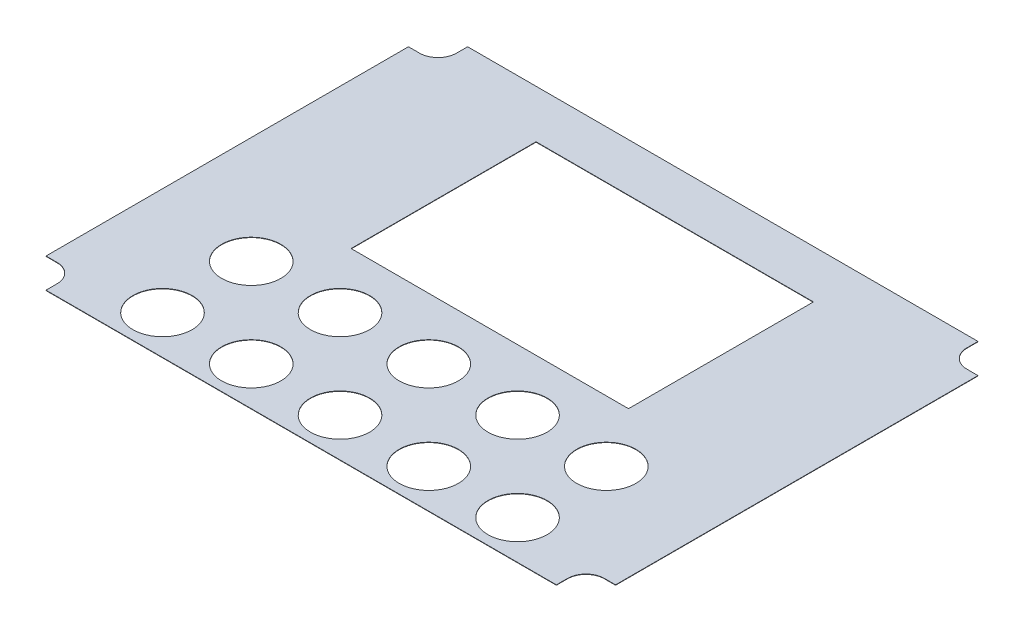
ISO-10303-21;
HEADER;
FILE_DESCRIPTION(('STEP AP214'),'2;1');
FILE_NAME('part.step','',(''),(''),'','','');
FILE_SCHEMA(('AUTOMOTIVE_DESIGN { 1 0 10303 214 1 1 1 1 }'));
ENDSEC;
DATA;
#1=APPLICATION_CONTEXT('core data for automotive mechanical design processes');
#2=APPLICATION_PROTOCOL_DEFINITION('international standard','automotive_design',2000,#1);
#3=PRODUCT_CONTEXT('',#1,'mechanical');
#4=PRODUCT('Part','Part','',(#3));
#5=PRODUCT_RELATED_PRODUCT_CATEGORY('part','',(#4));
#6=PRODUCT_DEFINITION_FORMATION('','',#4);
#7=PRODUCT_DEFINITION_CONTEXT('part definition',#1,'design');
#8=PRODUCT_DEFINITION('design','',#6,#7);
#9=PRODUCT_DEFINITION_SHAPE('','',#8);
#10=(LENGTH_UNIT() NAMED_UNIT(*) SI_UNIT(.MILLI.,.METRE.));
#11=(NAMED_UNIT(*) PLANE_ANGLE_UNIT() SI_UNIT($,.RADIAN.));
#12=(NAMED_UNIT(*) SI_UNIT($,.STERADIAN.) SOLID_ANGLE_UNIT());
#13=UNCERTAINTY_MEASURE_WITH_UNIT(LENGTH_MEASURE(1.E-05),#10,'distance_accuracy_value','');
#14=(GEOMETRIC_REPRESENTATION_CONTEXT(3) GLOBAL_UNCERTAINTY_ASSIGNED_CONTEXT((#13)) GLOBAL_UNIT_ASSIGNED_CONTEXT((#10,
#11,#12)) REPRESENTATION_CONTEXT('',''));
#15=CARTESIAN_POINT('',(0.,0.,0.));
#16=DIRECTION('',(0.,0.,1.));
#17=DIRECTION('',(1.,0.,0.));
#18=AXIS2_PLACEMENT_3D('',#15,#16,#17);
#19=CARTESIAN_POINT('',(77.,0.1,-57.));
#20=DIRECTION('',(-1.,0.,0.));
#21=DIRECTION('',(0.,0.,1.));
#22=AXIS2_PLACEMENT_3D('',#19,#20,#21);
#23=PLANE('',#22);
#24=DIRECTION('',(0.,0.,-1.));
#25=VECTOR('',#24,1.);
#26=CARTESIAN_POINT('',(77.,0.1,-57.));
#27=LINE('',#26,#25);
#28=CARTESIAN_POINT('',(77.,0.1,49.));
#29=VERTEX_POINT('',#28);
#30=CARTESIAN_POINT('',(77.,0.1,-49.));
#31=VERTEX_POINT('',#30);
#32=EDGE_CURVE('E327',#29,#31,#27,.T.);
#33=ORIENTED_EDGE('',*,*,#32,.F.);
#34=DIRECTION('',(0.,1.,0.));
#35=VECTOR('',#34,1.);
#36=CARTESIAN_POINT('',(77.,-0.9,49.));
#37=LINE('',#36,#35);
#38=CARTESIAN_POINT('',(77.,0.,49.));
#39=VERTEX_POINT('',#38);
#40=EDGE_CURVE('E280',#39,#29,#37,.T.);
#41=ORIENTED_EDGE('',*,*,#40,.F.);
#42=DIRECTION('',(0.,0.,-1.));
#43=VECTOR('',#42,1.);
#44=CARTESIAN_POINT('',(77.,0.,-57.));
#45=LINE('',#44,#43);
#46=CARTESIAN_POINT('',(77.,0.,-49.));
#47=VERTEX_POINT('',#46);
#48=EDGE_CURVE('E341',#39,#47,#45,.T.);
#49=ORIENTED_EDGE('',*,*,#48,.T.);
#50=DIRECTION('',(0.,1.,0.));
#51=VECTOR('',#50,1.);
#52=CARTESIAN_POINT('',(77.,-0.9,-49.));
#53=LINE('',#52,#51);
#54=EDGE_CURVE('E257',#47,#31,#53,.T.);
#55=ORIENTED_EDGE('',*,*,#54,.T.);
#56=EDGE_LOOP('',(#33,#41,#49,#55));
#57=FACE_BOUND('',#56,.T.);
#58=ADVANCED_FACE('F61',(#57),#23,.F.);
#59=CARTESIAN_POINT('',(-77.,0.1,-57.));
#60=DIRECTION('',(0.,0.,1.));
#61=DIRECTION('',(1.,0.,0.));
#62=AXIS2_PLACEMENT_3D('',#59,#60,#61);
#63=PLANE('',#62);
#64=DIRECTION('',(-1.,0.,0.));
#65=VECTOR('',#64,1.);
#66=CARTESIAN_POINT('',(-77.,0.1,-57.));
#67=LINE('',#66,#65);
#68=CARTESIAN_POINT('',(69.,0.1,-57.));
#69=VERTEX_POINT('',#68);
#70=CARTESIAN_POINT('',(-69.,0.1,-57.));
#71=VERTEX_POINT('',#70);
#72=EDGE_CURVE('E330',#69,#71,#67,.T.);
#73=ORIENTED_EDGE('',*,*,#72,.F.);
#74=DIRECTION('',(0.,1.,0.));
#75=VECTOR('',#74,1.);
#76=CARTESIAN_POINT('',(69.,-0.9,-57.));
#77=LINE('',#76,#75);
#78=CARTESIAN_POINT('',(69.,0.,-57.));
#79=VERTEX_POINT('',#78);
#80=EDGE_CURVE('E260',#79,#69,#77,.T.);
#81=ORIENTED_EDGE('',*,*,#80,.F.);
#82=DIRECTION('',(-1.,0.,0.));
#83=VECTOR('',#82,1.);
#84=CARTESIAN_POINT('',(-77.,0.,-57.));
#85=LINE('',#84,#83);
#86=CARTESIAN_POINT('',(-69.,0.,-57.));
#87=VERTEX_POINT('',#86);
#88=EDGE_CURVE('E344',#79,#87,#85,.T.);
#89=ORIENTED_EDGE('',*,*,#88,.T.);
#90=DIRECTION('',(0.,1.,0.));
#91=VECTOR('',#90,1.);
#92=CARTESIAN_POINT('',(-69.,-0.9,-57.));
#93=LINE('',#92,#91);
#94=EDGE_CURVE('E321',#87,#71,#93,.T.);
#95=ORIENTED_EDGE('',*,*,#94,.T.);
#96=EDGE_LOOP('',(#73,#81,#89,#95));
#97=FACE_BOUND('',#96,.T.);
#98=ADVANCED_FACE('F430',(#97),#63,.F.);
#99=CARTESIAN_POINT('',(-77.,0.1,-57.));
#100=DIRECTION('',(1.,0.,0.));
#101=DIRECTION('',(0.,0.,-1.));
#102=AXIS2_PLACEMENT_3D('',#99,#100,#101);
#103=PLANE('',#102);
#104=DIRECTION('',(0.,1.,0.));
#105=VECTOR('',#104,1.);
#106=CARTESIAN_POINT('',(-77.,-0.9,49.));
#107=LINE('',#106,#105);
#108=CARTESIAN_POINT('',(-77.,0.,49.));
#109=VERTEX_POINT('',#108);
#110=CARTESIAN_POINT('',(-77.,0.1,49.));
#111=VERTEX_POINT('',#110);
#112=EDGE_CURVE('E296',#109,#111,#107,.T.);
#113=ORIENTED_EDGE('',*,*,#112,.T.);
#114=DIRECTION('',(0.,0.,1.));
#115=VECTOR('',#114,1.);
#116=CARTESIAN_POINT('',(-77.,0.1,-57.));
#117=LINE('',#116,#115);
#118=CARTESIAN_POINT('',(-77.,0.1,-49.));
#119=VERTEX_POINT('',#118);
#120=EDGE_CURVE('E334',#119,#111,#117,.T.);
#121=ORIENTED_EDGE('',*,*,#120,.F.);
#122=DIRECTION('',(0.,1.,0.));
#123=VECTOR('',#122,1.);
#124=CARTESIAN_POINT('',(-77.,-0.9,-49.));
#125=LINE('',#124,#123);
#126=CARTESIAN_POINT('',(-77.,0.,-49.));
#127=VERTEX_POINT('',#126);
#128=EDGE_CURVE('E318',#127,#119,#125,.T.);
#129=ORIENTED_EDGE('',*,*,#128,.F.);
#130=DIRECTION('',(0.,0.,1.));
#131=VECTOR('',#130,1.);
#132=CARTESIAN_POINT('',(-77.,0.,-57.));
#133=LINE('',#132,#131);
#134=EDGE_CURVE('E347',#127,#109,#133,.T.);
#135=ORIENTED_EDGE('',*,*,#134,.T.);
#136=EDGE_LOOP('',(#113,#121,#129,#135));
#137=FACE_BOUND('',#136,.T.);
#138=ADVANCED_FACE('F435',(#137),#103,.F.);
#139=CARTESIAN_POINT('',(-77.,0.1,57.));
#140=DIRECTION('',(0.,0.,-1.));
#141=DIRECTION('',(-1.,0.,0.));
#142=AXIS2_PLACEMENT_3D('',#139,#140,#141);
#143=PLANE('',#142);
#144=DIRECTION('',(1.,0.,0.));
#145=VECTOR('',#144,1.);
#146=CARTESIAN_POINT('',(-77.,0.1,57.));
#147=LINE('',#146,#145);
#148=CARTESIAN_POINT('',(-69.,0.1,57.));
#149=VERTEX_POINT('',#148);
#150=CARTESIAN_POINT('',(69.,0.1,57.));
#151=VERTEX_POINT('',#150);
#152=EDGE_CURVE('E337',#149,#151,#147,.T.);
#153=ORIENTED_EDGE('',*,*,#152,.F.);
#154=DIRECTION('',(0.,1.,0.));
#155=VECTOR('',#154,1.);
#156=CARTESIAN_POINT('',(-69.,-0.9,57.));
#157=LINE('',#156,#155);
#158=CARTESIAN_POINT('',(-69.,0.,57.));
#159=VERTEX_POINT('',#158);
#160=EDGE_CURVE('E299',#159,#149,#157,.T.);
#161=ORIENTED_EDGE('',*,*,#160,.F.);
#162=DIRECTION('',(1.,0.,0.));
#163=VECTOR('',#162,1.);
#164=CARTESIAN_POINT('',(-77.,0.,57.));
#165=LINE('',#164,#163);
#166=CARTESIAN_POINT('',(69.,0.,57.));
#167=VERTEX_POINT('',#166);
#168=EDGE_CURVE('E331',#159,#167,#165,.T.);
#169=ORIENTED_EDGE('',*,*,#168,.T.);
#170=DIRECTION('',(0.,1.,0.));
#171=VECTOR('',#170,1.);
#172=CARTESIAN_POINT('',(69.,-0.9,57.));
#173=LINE('',#172,#171);
#174=EDGE_CURVE('E277',#167,#151,#173,.T.);
#175=ORIENTED_EDGE('',*,*,#174,.T.);
#176=EDGE_LOOP('',(#153,#161,#169,#175));
#177=FACE_BOUND('',#176,.T.);
#178=ADVANCED_FACE('F492',(#177),#143,.F.);
#179=CARTESIAN_POINT('',(0.,0.1,0.));
#180=DIRECTION('',(0.,1.,0.));
#181=DIRECTION('',(0.,0.,1.));
#182=AXIS2_PLACEMENT_3D('',#179,#180,#181);
#183=PLANE('',#182);
#184=CARTESIAN_POINT('',(48.,0.1,22.5));
#185=DIRECTION('',(0.,1.,0.));
#186=DIRECTION('',(0.,0.,1.));
#187=AXIS2_PLACEMENT_3D('',#184,#185,#186);
#188=CIRCLE('',#187,7.99999999999999);
#189=CARTESIAN_POINT('',(48.,0.1,30.5));
#190=VERTEX_POINT('',#189);
#191=EDGE_CURVE('E233',#190,#190,#188,.T.);
#192=ORIENTED_EDGE('',*,*,#191,.F.);
#193=EDGE_LOOP('',(#192));
#194=FACE_BOUND('',#193,.T.);
#195=CARTESIAN_POINT('',(24.,0.1,22.5));
#196=DIRECTION('',(0.,1.,0.));
#197=DIRECTION('',(0.,0.,1.));
#198=AXIS2_PLACEMENT_3D('',#195,#196,#197);
#199=CIRCLE('',#198,7.99999999999999);
#200=CARTESIAN_POINT('',(24.,0.1,30.5));
#201=VERTEX_POINT('',#200);
#202=EDGE_CURVE('E249',#201,#201,#199,.T.);
#203=ORIENTED_EDGE('',*,*,#202,.F.);
#204=EDGE_LOOP('',(#203));
#205=FACE_BOUND('',#204,.T.);
#206=CARTESIAN_POINT('',(0.,0.1,22.5));
#207=DIRECTION('',(0.,1.,0.));
#208=DIRECTION('',(0.,0.,1.));
#209=AXIS2_PLACEMENT_3D('',#206,#207,#208);
#210=CIRCLE('',#209,7.99999999999999);
#211=CARTESIAN_POINT('',(0.,0.1,30.5));
#212=VERTEX_POINT('',#211);
#213=EDGE_CURVE('E246',#212,#212,#210,.T.);
#214=ORIENTED_EDGE('',*,*,#213,.F.);
#215=EDGE_LOOP('',(#214));
#216=FACE_BOUND('',#215,.T.);
#217=CARTESIAN_POINT('',(-24.,0.1,22.5));
#218=DIRECTION('',(0.,1.,0.));
#219=DIRECTION('',(0.,0.,1.));
#220=AXIS2_PLACEMENT_3D('',#217,#218,#219);
#221=CIRCLE('',#220,7.99999999999999);
#222=CARTESIAN_POINT('',(-24.,0.1,30.5));
#223=VERTEX_POINT('',#222);
#224=EDGE_CURVE('E242',#223,#223,#221,.T.);
#225=ORIENTED_EDGE('',*,*,#224,.F.);
#226=EDGE_LOOP('',(#225));
#227=FACE_BOUND('',#226,.T.);
#228=CARTESIAN_POINT('',(-48.,0.1,22.5));
#229=DIRECTION('',(0.,1.,0.));
#230=DIRECTION('',(0.,0.,1.));
#231=AXIS2_PLACEMENT_3D('',#228,#229,#230);
#232=CIRCLE('',#231,7.99999999999999);
#233=CARTESIAN_POINT('',(-48.,0.1,30.5));
#234=VERTEX_POINT('',#233);
#235=EDGE_CURVE('E245',#234,#234,#232,.T.);
#236=ORIENTED_EDGE('',*,*,#235,.F.);
#237=EDGE_LOOP('',(#236));
#238=FACE_BOUND('',#237,.T.);
#239=DIRECTION('',(0.,0.,-1.));
#240=VECTOR('',#239,1.);
#241=CARTESIAN_POINT('',(-69.,0.1,0.));
#242=LINE('',#241,#240);
#243=CARTESIAN_POINT('',(-69.,0.1,54.));
#244=VERTEX_POINT('',#243);
#245=EDGE_CURVE('E284',#149,#244,#242,.T.);
#246=ORIENTED_EDGE('',*,*,#245,.F.);
#247=ORIENTED_EDGE('',*,*,#152,.T.);
#248=DIRECTION('',(0.,0.,-1.));
#249=VECTOR('',#248,1.);
#250=CARTESIAN_POINT('',(69.,0.1,0.));
#251=LINE('',#250,#249);
#252=CARTESIAN_POINT('',(69.,0.1,54.));
#253=VERTEX_POINT('',#252);
#254=EDGE_CURVE('E287',#151,#253,#251,.T.);
#255=ORIENTED_EDGE('',*,*,#254,.T.);
#256=CARTESIAN_POINT('',(74.,0.1,54.));
#257=DIRECTION('',(0.,1.,0.));
#258=DIRECTION('',(0.,0.,1.));
#259=AXIS2_PLACEMENT_3D('',#256,#257,#258);
#260=CIRCLE('',#259,5.);
#261=CARTESIAN_POINT('',(74.,0.1,49.));
#262=VERTEX_POINT('',#261);
#263=EDGE_CURVE('E264',#253,#262,#260,.F.);
#264=ORIENTED_EDGE('',*,*,#263,.T.);
#265=DIRECTION('',(-1.,0.,0.));
#266=VECTOR('',#265,1.);
#267=CARTESIAN_POINT('',(0.,0.1,49.));
#268=LINE('',#267,#266);
#269=EDGE_CURVE('E276',#29,#262,#268,.T.);
#270=ORIENTED_EDGE('',*,*,#269,.F.);
#271=ORIENTED_EDGE('',*,*,#32,.T.);
#272=DIRECTION('',(-1.,0.,0.));
#273=VECTOR('',#272,1.);
#274=CARTESIAN_POINT('',(0.,0.1,-49.));
#275=LINE('',#274,#273);
#276=CARTESIAN_POINT('',(74.,0.1,-49.));
#277=VERTEX_POINT('',#276);
#278=EDGE_CURVE('E267',#31,#277,#275,.T.);
#279=ORIENTED_EDGE('',*,*,#278,.T.);
#280=CARTESIAN_POINT('',(74.,0.1,-54.));
#281=DIRECTION('',(0.,1.,0.));
#282=DIRECTION('',(0.,0.,1.));
#283=AXIS2_PLACEMENT_3D('',#280,#281,#282);
#284=CIRCLE('',#283,5.);
#285=CARTESIAN_POINT('',(69.,0.1,-54.));
#286=VERTEX_POINT('',#285);
#287=EDGE_CURVE('E270',#277,#286,#284,.F.);
#288=ORIENTED_EDGE('',*,*,#287,.T.);
#289=DIRECTION('',(0.,0.,1.));
#290=VECTOR('',#289,1.);
#291=CARTESIAN_POINT('',(69.,0.1,0.));
#292=LINE('',#291,#290);
#293=EDGE_CURVE('E256',#69,#286,#292,.T.);
#294=ORIENTED_EDGE('',*,*,#293,.F.);
#295=ORIENTED_EDGE('',*,*,#72,.T.);
#296=DIRECTION('',(0.,0.,1.));
#297=VECTOR('',#296,1.);
#298=CARTESIAN_POINT('',(-68.9999999999998,0.1,3.19189119579737E-13));
#299=LINE('',#298,#297);
#300=CARTESIAN_POINT('',(-69.,0.1,-54.));
#301=VERTEX_POINT('',#300);
#302=EDGE_CURVE('E314',#71,#301,#299,.T.);
#303=ORIENTED_EDGE('',*,*,#302,.T.);
#304=CARTESIAN_POINT('',(-74.,0.1,-54.));
#305=DIRECTION('',(0.,1.,0.));
#306=DIRECTION('',(0.,0.,1.));
#307=AXIS2_PLACEMENT_3D('',#304,#305,#306);
#308=CIRCLE('',#307,5.);
#309=CARTESIAN_POINT('',(-74.0000000000001,0.1,-49.));
#310=VERTEX_POINT('',#309);
#311=EDGE_CURVE('E311',#310,#301,#308,.T.);
#312=ORIENTED_EDGE('',*,*,#311,.F.);
#313=DIRECTION('',(1.,0.,0.));
#314=VECTOR('',#313,1.);
#315=CARTESIAN_POINT('',(0.,0.1,-49.));
#316=LINE('',#315,#314);
#317=EDGE_CURVE('E273',#119,#310,#316,.T.);
#318=ORIENTED_EDGE('',*,*,#317,.F.);
#319=ORIENTED_EDGE('',*,*,#120,.T.);
#320=DIRECTION('',(1.,0.,0.));
#321=VECTOR('',#320,1.);
#322=CARTESIAN_POINT('',(0.,0.1,49.));
#323=LINE('',#322,#321);
#324=CARTESIAN_POINT('',(-74.,0.1,49.));
#325=VERTEX_POINT('',#324);
#326=EDGE_CURVE('E294',#111,#325,#323,.T.);
#327=ORIENTED_EDGE('',*,*,#326,.T.);
#328=CARTESIAN_POINT('',(-74.,0.1,54.));
#329=DIRECTION('',(0.,1.,0.));
#330=DIRECTION('',(0.,0.,1.));
#331=AXIS2_PLACEMENT_3D('',#328,#329,#330);
#332=CIRCLE('',#331,5.);
#333=EDGE_CURVE('E303',#244,#325,#332,.T.);
#334=ORIENTED_EDGE('',*,*,#333,.F.);
#335=EDGE_LOOP('',(#246,#247,#255,#264,#270,#271,#279,#288,#294,#295,#303,#312,#318,#319,#327,#334));
#336=FACE_BOUND('',#335,.T.);
#337=CARTESIAN_POINT('',(-47.9999999999998,0.1,46.5));
#338=DIRECTION('',(0.,1.,0.));
#339=DIRECTION('',(0.,0.,1.));
#340=AXIS2_PLACEMENT_3D('',#337,#338,#339);
#341=CIRCLE('',#340,7.99999999999999);
#342=CARTESIAN_POINT('',(-47.9999999999998,0.1,54.5));
#343=VERTEX_POINT('',#342);
#344=EDGE_CURVE('E222',#343,#343,#341,.T.);
#345=ORIENTED_EDGE('',*,*,#344,.F.);
#346=EDGE_LOOP('',(#345));
#347=FACE_BOUND('',#346,.T.);
#348=CARTESIAN_POINT('',(-23.9999999999998,0.1,46.5));
#349=DIRECTION('',(0.,1.,0.));
#350=DIRECTION('',(0.,0.,1.));
#351=AXIS2_PLACEMENT_3D('',#348,#349,#350);
#352=CIRCLE('',#351,7.99999999999999);
#353=CARTESIAN_POINT('',(-23.9999999999998,0.1,54.5));
#354=VERTEX_POINT('',#353);
#355=EDGE_CURVE('E225',#354,#354,#352,.T.);
#356=ORIENTED_EDGE('',*,*,#355,.F.);
#357=EDGE_LOOP('',(#356));
#358=FACE_BOUND('',#357,.T.);
#359=CARTESIAN_POINT('',(2.4980018054066E-13,0.1,46.5));
#360=DIRECTION('',(0.,1.,0.));
#361=DIRECTION('',(0.,0.,1.));
#362=AXIS2_PLACEMENT_3D('',#359,#360,#361);
#363=CIRCLE('',#362,7.99999999999999);
#364=CARTESIAN_POINT('',(2.4980018054066E-13,0.1,54.5));
#365=VERTEX_POINT('',#364);
#366=EDGE_CURVE('E237',#365,#365,#363,.T.);
#367=ORIENTED_EDGE('',*,*,#366,.F.);
#368=EDGE_LOOP('',(#367));
#369=FACE_BOUND('',#368,.T.);
#370=CARTESIAN_POINT('',(24.0000000000003,0.1,46.5));
#371=DIRECTION('',(0.,1.,0.));
#372=DIRECTION('',(0.,0.,1.));
#373=AXIS2_PLACEMENT_3D('',#370,#371,#372);
#374=CIRCLE('',#373,7.99999999999999);
#375=CARTESIAN_POINT('',(24.0000000000003,0.1,54.5));
#376=VERTEX_POINT('',#375);
#377=EDGE_CURVE('E234',#376,#376,#374,.T.);
#378=ORIENTED_EDGE('',*,*,#377,.F.);
#379=EDGE_LOOP('',(#378));
#380=FACE_BOUND('',#379,.T.);
#381=CARTESIAN_POINT('',(48.0000000000002,0.1,46.5));
#382=DIRECTION('',(0.,1.,0.));
#383=DIRECTION('',(0.,0.,1.));
#384=AXIS2_PLACEMENT_3D('',#381,#382,#383);
#385=CIRCLE('',#384,7.99999999999999);
#386=CARTESIAN_POINT('',(48.0000000000002,0.1,54.5));
#387=VERTEX_POINT('',#386);
#388=EDGE_CURVE('E230',#387,#387,#385,.T.);
#389=ORIENTED_EDGE('',*,*,#388,.F.);
#390=EDGE_LOOP('',(#389));
#391=FACE_BOUND('',#390,.T.);
#392=DIRECTION('',(1.,0.,0.));
#393=VECTOR('',#392,1.);
#394=CARTESIAN_POINT('',(0.,0.1,-44.));
#395=LINE('',#394,#393);
#396=CARTESIAN_POINT('',(-37.5,0.1,-44.));
#397=VERTEX_POINT('',#396);
#398=CARTESIAN_POINT('',(37.5,0.1,-44.));
#399=VERTEX_POINT('',#398);
#400=EDGE_CURVE('E221',#397,#399,#395,.T.);
#401=ORIENTED_EDGE('',*,*,#400,.T.);
#402=DIRECTION('',(0.,0.,1.));
#403=VECTOR('',#402,1.);
#404=CARTESIAN_POINT('',(37.5,0.1,0.));
#405=LINE('',#404,#403);
#406=CARTESIAN_POINT('',(37.5,0.1,6.00000000000001));
#407=VERTEX_POINT('',#406);
#408=EDGE_CURVE('E205',#399,#407,#405,.T.);
#409=ORIENTED_EDGE('',*,*,#408,.T.);
#410=DIRECTION('',(1.,0.,0.));
#411=VECTOR('',#410,1.);
#412=CARTESIAN_POINT('',(0.,0.1,6.00000000000001));
#413=LINE('',#412,#411);
#414=CARTESIAN_POINT('',(-37.5,0.1,6.00000000000001));
#415=VERTEX_POINT('',#414);
#416=EDGE_CURVE('E214',#415,#407,#413,.T.);
#417=ORIENTED_EDGE('',*,*,#416,.F.);
#418=DIRECTION('',(0.,0.,1.));
#419=VECTOR('',#418,1.);
#420=CARTESIAN_POINT('',(-37.5,0.1,0.));
#421=LINE('',#420,#419);
#422=EDGE_CURVE('E77',#397,#415,#421,.T.);
#423=ORIENTED_EDGE('',*,*,#422,.F.);
#424=EDGE_LOOP('',(#401,#409,#417,#423));
#425=FACE_BOUND('',#424,.T.);
#426=ADVANCED_FACE('F219',(#194,#205,#216,#227,#238,#336,#347,#358,#369,#380,#391,#425),#183,.T.);
#427=CARTESIAN_POINT('',(0.,0.,0.));
#428=DIRECTION('',(0.,1.,0.));
#429=DIRECTION('',(0.,0.,1.));
#430=AXIS2_PLACEMENT_3D('',#427,#428,#429);
#431=PLANE('',#430);
#432=CARTESIAN_POINT('',(48.,0.,22.5));
#433=DIRECTION('',(0.,1.,0.));
#434=DIRECTION('',(0.,0.,1.));
#435=AXIS2_PLACEMENT_3D('',#432,#433,#434);
#436=CIRCLE('',#435,7.99999999999999);
#437=CARTESIAN_POINT('',(48.,0.,30.5));
#438=VERTEX_POINT('',#437);
#439=EDGE_CURVE('E64',#438,#438,#436,.T.);
#440=ORIENTED_EDGE('',*,*,#439,.T.);
#441=EDGE_LOOP('',(#440));
#442=FACE_BOUND('',#441,.T.);
#443=CARTESIAN_POINT('',(24.,0.,22.5));
#444=DIRECTION('',(0.,1.,0.));
#445=DIRECTION('',(0.,0.,1.));
#446=AXIS2_PLACEMENT_3D('',#443,#444,#445);
#447=CIRCLE('',#446,7.99999999999999);
#448=CARTESIAN_POINT('',(24.,0.,30.5));
#449=VERTEX_POINT('',#448);
#450=EDGE_CURVE('E408',#449,#449,#447,.T.);
#451=ORIENTED_EDGE('',*,*,#450,.T.);
#452=EDGE_LOOP('',(#451));
#453=FACE_BOUND('',#452,.T.);
#454=CARTESIAN_POINT('',(0.,0.,22.5));
#455=DIRECTION('',(0.,1.,0.));
#456=DIRECTION('',(0.,0.,1.));
#457=AXIS2_PLACEMENT_3D('',#454,#455,#456);
#458=CIRCLE('',#457,7.99999999999999);
#459=CARTESIAN_POINT('',(0.,0.,30.5));
#460=VERTEX_POINT('',#459);
#461=EDGE_CURVE('E406',#460,#460,#458,.T.);
#462=ORIENTED_EDGE('',*,*,#461,.T.);
#463=EDGE_LOOP('',(#462));
#464=FACE_BOUND('',#463,.T.);
#465=CARTESIAN_POINT('',(-24.,0.,22.5));
#466=DIRECTION('',(0.,1.,0.));
#467=DIRECTION('',(0.,0.,1.));
#468=AXIS2_PLACEMENT_3D('',#465,#466,#467);
#469=CIRCLE('',#468,7.99999999999999);
#470=CARTESIAN_POINT('',(-24.,0.,30.5));
#471=VERTEX_POINT('',#470);
#472=EDGE_CURVE('E403',#471,#471,#469,.T.);
#473=ORIENTED_EDGE('',*,*,#472,.T.);
#474=EDGE_LOOP('',(#473));
#475=FACE_BOUND('',#474,.T.);
#476=CARTESIAN_POINT('',(-48.,0.,22.5));
#477=DIRECTION('',(0.,1.,0.));
#478=DIRECTION('',(0.,0.,1.));
#479=AXIS2_PLACEMENT_3D('',#476,#477,#478);
#480=CIRCLE('',#479,7.99999999999999);
#481=CARTESIAN_POINT('',(-48.,0.,30.5));
#482=VERTEX_POINT('',#481);
#483=EDGE_CURVE('E375',#482,#482,#480,.T.);
#484=ORIENTED_EDGE('',*,*,#483,.T.);
#485=EDGE_LOOP('',(#484));
#486=FACE_BOUND('',#485,.T.);
#487=ORIENTED_EDGE('',*,*,#168,.F.);
#488=DIRECTION('',(0.,0.,-1.));
#489=VECTOR('',#488,1.);
#490=CARTESIAN_POINT('',(-69.,0.,0.));
#491=LINE('',#490,#489);
#492=CARTESIAN_POINT('',(-69.,0.,54.));
#493=VERTEX_POINT('',#492);
#494=EDGE_CURVE('E12',#159,#493,#491,.T.);
#495=ORIENTED_EDGE('',*,*,#494,.T.);
#496=CARTESIAN_POINT('',(-74.,0.,54.));
#497=DIRECTION('',(0.,1.,0.));
#498=DIRECTION('',(0.,0.,1.));
#499=AXIS2_PLACEMENT_3D('',#496,#497,#498);
#500=CIRCLE('',#499,5.);
#501=CARTESIAN_POINT('',(-74.,0.,49.));
#502=VERTEX_POINT('',#501);
#503=EDGE_CURVE('E397',#493,#502,#500,.T.);
#504=ORIENTED_EDGE('',*,*,#503,.T.);
#505=DIRECTION('',(1.,0.,0.));
#506=VECTOR('',#505,1.);
#507=CARTESIAN_POINT('',(0.,0.,49.));
#508=LINE('',#507,#506);
#509=EDGE_CURVE('E69',#109,#502,#508,.T.);
#510=ORIENTED_EDGE('',*,*,#509,.F.);
#511=ORIENTED_EDGE('',*,*,#134,.F.);
#512=DIRECTION('',(1.,0.,0.));
#513=VECTOR('',#512,1.);
#514=CARTESIAN_POINT('',(0.,0.,-49.));
#515=LINE('',#514,#513);
#516=CARTESIAN_POINT('',(-74.0000000000001,0.,-49.));
#517=VERTEX_POINT('',#516);
#518=EDGE_CURVE('E357',#127,#517,#515,.T.);
#519=ORIENTED_EDGE('',*,*,#518,.T.);
#520=CARTESIAN_POINT('',(-74.,0.,-54.));
#521=DIRECTION('',(0.,1.,0.));
#522=DIRECTION('',(0.,0.,1.));
#523=AXIS2_PLACEMENT_3D('',#520,#521,#522);
#524=CIRCLE('',#523,5.);
#525=CARTESIAN_POINT('',(-69.,0.,-54.));
#526=VERTEX_POINT('',#525);
#527=EDGE_CURVE('E340',#517,#526,#524,.T.);
#528=ORIENTED_EDGE('',*,*,#527,.T.);
#529=DIRECTION('',(0.,0.,1.));
#530=VECTOR('',#529,1.);
#531=CARTESIAN_POINT('',(-68.9999999999998,0.,3.19189119579737E-13));
#532=LINE('',#531,#530);
#533=EDGE_CURVE('E354',#87,#526,#532,.T.);
#534=ORIENTED_EDGE('',*,*,#533,.F.);
#535=ORIENTED_EDGE('',*,*,#88,.F.);
#536=DIRECTION('',(0.,0.,1.));
#537=VECTOR('',#536,1.);
#538=CARTESIAN_POINT('',(69.,0.,0.));
#539=LINE('',#538,#537);
#540=CARTESIAN_POINT('',(69.,0.,-54.));
#541=VERTEX_POINT('',#540);
#542=EDGE_CURVE('E387',#79,#541,#539,.T.);
#543=ORIENTED_EDGE('',*,*,#542,.T.);
#544=CARTESIAN_POINT('',(74.,0.,-54.));
#545=DIRECTION('',(0.,1.,0.));
#546=DIRECTION('',(0.,0.,1.));
#547=AXIS2_PLACEMENT_3D('',#544,#545,#546);
#548=CIRCLE('',#547,5.);
#549=CARTESIAN_POINT('',(74.,0.,-49.));
#550=VERTEX_POINT('',#549);
#551=EDGE_CURVE('E385',#550,#541,#548,.F.);
#552=ORIENTED_EDGE('',*,*,#551,.F.);
#553=DIRECTION('',(-1.,0.,0.));
#554=VECTOR('',#553,1.);
#555=CARTESIAN_POINT('',(0.,0.,-49.));
#556=LINE('',#555,#554);
#557=EDGE_CURVE('E383',#47,#550,#556,.T.);
#558=ORIENTED_EDGE('',*,*,#557,.F.);
#559=ORIENTED_EDGE('',*,*,#48,.F.);
#560=DIRECTION('',(-1.,0.,0.));
#561=VECTOR('',#560,1.);
#562=CARTESIAN_POINT('',(0.,0.,49.));
#563=LINE('',#562,#561);
#564=CARTESIAN_POINT('',(74.,0.,49.));
#565=VERTEX_POINT('',#564);
#566=EDGE_CURVE('E394',#39,#565,#563,.T.);
#567=ORIENTED_EDGE('',*,*,#566,.T.);
#568=CARTESIAN_POINT('',(74.,0.,54.));
#569=DIRECTION('',(0.,1.,0.));
#570=DIRECTION('',(0.,0.,1.));
#571=AXIS2_PLACEMENT_3D('',#568,#569,#570);
#572=CIRCLE('',#571,5.);
#573=CARTESIAN_POINT('',(69.,0.,54.));
#574=VERTEX_POINT('',#573);
#575=EDGE_CURVE('E392',#574,#565,#572,.F.);
#576=ORIENTED_EDGE('',*,*,#575,.F.);
#577=DIRECTION('',(0.,0.,-1.));
#578=VECTOR('',#577,1.);
#579=CARTESIAN_POINT('',(69.,0.,0.));
#580=LINE('',#579,#578);
#581=EDGE_CURVE('E390',#167,#574,#580,.T.);
#582=ORIENTED_EDGE('',*,*,#581,.F.);
#583=EDGE_LOOP('',(#487,#495,#504,#510,#511,#519,#528,#534,#535,#543,#552,#558,#559,#567,#576,#582));
#584=FACE_BOUND('',#583,.T.);
#585=CARTESIAN_POINT('',(48.0000000000002,0.,46.5));
#586=DIRECTION('',(0.,1.,0.));
#587=DIRECTION('',(0.,0.,1.));
#588=AXIS2_PLACEMENT_3D('',#585,#586,#587);
#589=CIRCLE('',#588,7.99999999999999);
#590=CARTESIAN_POINT('',(48.0000000000002,0.,54.5));
#591=VERTEX_POINT('',#590);
#592=EDGE_CURVE('E320',#591,#591,#589,.T.);
#593=ORIENTED_EDGE('',*,*,#592,.T.);
#594=EDGE_LOOP('',(#593));
#595=FACE_BOUND('',#594,.T.);
#596=CARTESIAN_POINT('',(24.0000000000003,0.,46.5));
#597=DIRECTION('',(0.,1.,0.));
#598=DIRECTION('',(0.,0.,1.));
#599=AXIS2_PLACEMENT_3D('',#596,#597,#598);
#600=CIRCLE('',#599,7.99999999999999);
#601=CARTESIAN_POINT('',(24.0000000000003,0.,54.5));
#602=VERTEX_POINT('',#601);
#603=EDGE_CURVE('E363',#602,#602,#600,.T.);
#604=ORIENTED_EDGE('',*,*,#603,.T.);
#605=EDGE_LOOP('',(#604));
#606=FACE_BOUND('',#605,.T.);
#607=CARTESIAN_POINT('',(2.4980018054066E-13,0.,46.5));
#608=DIRECTION('',(0.,1.,0.));
#609=DIRECTION('',(0.,0.,1.));
#610=AXIS2_PLACEMENT_3D('',#607,#608,#609);
#611=CIRCLE('',#610,7.99999999999999);
#612=CARTESIAN_POINT('',(2.4980018054066E-13,0.,54.5));
#613=VERTEX_POINT('',#612);
#614=EDGE_CURVE('E366',#613,#613,#611,.T.);
#615=ORIENTED_EDGE('',*,*,#614,.T.);
#616=EDGE_LOOP('',(#615));
#617=FACE_BOUND('',#616,.T.);
#618=CARTESIAN_POINT('',(-23.9999999999998,0.,46.5));
#619=DIRECTION('',(0.,1.,0.));
#620=DIRECTION('',(0.,0.,1.));
#621=AXIS2_PLACEMENT_3D('',#618,#619,#620);
#622=CIRCLE('',#621,7.99999999999999);
#623=CARTESIAN_POINT('',(-23.9999999999998,0.,54.5));
#624=VERTEX_POINT('',#623);
#625=EDGE_CURVE('E369',#624,#624,#622,.T.);
#626=ORIENTED_EDGE('',*,*,#625,.T.);
#627=EDGE_LOOP('',(#626));
#628=FACE_BOUND('',#627,.T.);
#629=CARTESIAN_POINT('',(-47.9999999999998,0.,46.5));
#630=DIRECTION('',(0.,1.,0.));
#631=DIRECTION('',(0.,0.,1.));
#632=AXIS2_PLACEMENT_3D('',#629,#630,#631);
#633=CIRCLE('',#632,7.99999999999999);
#634=CARTESIAN_POINT('',(-47.9999999999998,0.,54.5));
#635=VERTEX_POINT('',#634);
#636=EDGE_CURVE('E372',#635,#635,#633,.T.);
#637=ORIENTED_EDGE('',*,*,#636,.T.);
#638=EDGE_LOOP('',(#637));
#639=FACE_BOUND('',#638,.T.);
#640=DIRECTION('',(0.,0.,1.));
#641=VECTOR('',#640,1.);
#642=CARTESIAN_POINT('',(37.5,0.,0.));
#643=LINE('',#642,#641);
#644=CARTESIAN_POINT('',(37.5,0.,-44.));
#645=VERTEX_POINT('',#644);
#646=CARTESIAN_POINT('',(37.5,0.,6.00000000000001));
#647=VERTEX_POINT('',#646);
#648=EDGE_CURVE('E208',#645,#647,#643,.T.);
#649=ORIENTED_EDGE('',*,*,#648,.F.);
#650=DIRECTION('',(1.,0.,0.));
#651=VECTOR('',#650,1.);
#652=CARTESIAN_POINT('',(0.,0.,-44.));
#653=LINE('',#652,#651);
#654=CARTESIAN_POINT('',(-37.5,0.,-44.));
#655=VERTEX_POINT('',#654);
#656=EDGE_CURVE('E380',#655,#645,#653,.T.);
#657=ORIENTED_EDGE('',*,*,#656,.F.);
#658=DIRECTION('',(0.,0.,1.));
#659=VECTOR('',#658,1.);
#660=CARTESIAN_POINT('',(-37.5,0.,0.));
#661=LINE('',#660,#659);
#662=CARTESIAN_POINT('',(-37.5,0.,6.00000000000001));
#663=VERTEX_POINT('',#662);
#664=EDGE_CURVE('E377',#655,#663,#661,.T.);
#665=ORIENTED_EDGE('',*,*,#664,.T.);
#666=DIRECTION('',(1.,0.,0.));
#667=VECTOR('',#666,1.);
#668=CARTESIAN_POINT('',(0.,0.,6.00000000000001));
#669=LINE('',#668,#667);
#670=EDGE_CURVE('E360',#663,#647,#669,.T.);
#671=ORIENTED_EDGE('',*,*,#670,.T.);
#672=EDGE_LOOP('',(#649,#657,#665,#671));
#673=FACE_BOUND('',#672,.T.);
#674=ADVANCED_FACE('F415',(#442,#453,#464,#475,#486,#584,#595,#606,#617,#628,#639,#673),#431,.F.);
#675=CARTESIAN_POINT('',(0.,-0.9,-49.));
#676=DIRECTION('',(0.,0.,1.));
#677=DIRECTION('',(1.,0.,0.));
#678=AXIS2_PLACEMENT_3D('',#675,#676,#677);
#679=PLANE('',#678);
#680=ORIENTED_EDGE('',*,*,#128,.T.);
#681=ORIENTED_EDGE('',*,*,#317,.T.);
#682=DIRECTION('',(0.,1.,0.));
#683=VECTOR('',#682,1.);
#684=CARTESIAN_POINT('',(-74.0000000000001,-0.9,-49.));
#685=LINE('',#684,#683);
#686=EDGE_CURVE('E317',#517,#310,#685,.T.);
#687=ORIENTED_EDGE('',*,*,#686,.F.);
#688=ORIENTED_EDGE('',*,*,#518,.F.);
#689=EDGE_LOOP('',(#680,#681,#687,#688));
#690=FACE_BOUND('',#689,.T.);
#691=ADVANCED_FACE('F475',(#690),#679,.F.);
#692=CARTESIAN_POINT('',(-68.9999999999998,-0.9,3.19189119579737E-13));
#693=DIRECTION('',(-1.,0.,0.));
#694=DIRECTION('',(0.,0.,1.));
#695=AXIS2_PLACEMENT_3D('',#692,#693,#694);
#696=PLANE('',#695);
#697=ORIENTED_EDGE('',*,*,#533,.T.);
#698=DIRECTION('',(0.,1.,0.));
#699=VECTOR('',#698,1.);
#700=CARTESIAN_POINT('',(-69.,-0.9,-54.));
#701=LINE('',#700,#699);
#702=EDGE_CURVE('E324',#526,#301,#701,.T.);
#703=ORIENTED_EDGE('',*,*,#702,.T.);
#704=ORIENTED_EDGE('',*,*,#302,.F.);
#705=ORIENTED_EDGE('',*,*,#94,.F.);
#706=EDGE_LOOP('',(#697,#703,#704,#705));
#707=FACE_BOUND('',#706,.T.);
#708=ADVANCED_FACE('F469',(#707),#696,.T.);
#709=CARTESIAN_POINT('',(-74.,-0.9,-54.));
#710=DIRECTION('',(0.,1.,0.));
#711=DIRECTION('',(0.,0.,1.));
#712=AXIS2_PLACEMENT_3D('',#709,#710,#711);
#713=CYLINDRICAL_SURFACE('',#712,5.);
#714=ORIENTED_EDGE('',*,*,#686,.T.);
#715=ORIENTED_EDGE('',*,*,#311,.T.);
#716=ORIENTED_EDGE('',*,*,#702,.F.);
#717=ORIENTED_EDGE('',*,*,#527,.F.);
#718=EDGE_LOOP('',(#714,#715,#716,#717));
#719=FACE_BOUND('',#718,.T.);
#720=ADVANCED_FACE('F473',(#719),#713,.F.);
#721=CARTESIAN_POINT('',(48.0000000000002,-0.9,46.5));
#722=DIRECTION('',(0.,1.,0.));
#723=DIRECTION('',(0.,0.,1.));
#724=AXIS2_PLACEMENT_3D('',#721,#722,#723);
#725=CYLINDRICAL_SURFACE('',#724,7.99999999999999);
#726=ORIENTED_EDGE('',*,*,#388,.T.);
#727=EDGE_LOOP('',(#726));
#728=FACE_BOUND('',#727,.T.);
#729=ORIENTED_EDGE('',*,*,#592,.F.);
#730=EDGE_LOOP('',(#729));
#731=FACE_BOUND('',#730,.T.);
#732=ADVANCED_FACE('F526',(#728,#731),#725,.F.);
#733=CARTESIAN_POINT('',(24.0000000000003,-0.9,46.5));
#734=DIRECTION('',(0.,1.,0.));
#735=DIRECTION('',(0.,0.,1.));
#736=AXIS2_PLACEMENT_3D('',#733,#734,#735);
#737=CYLINDRICAL_SURFACE('',#736,7.99999999999999);
#738=ORIENTED_EDGE('',*,*,#377,.T.);
#739=EDGE_LOOP('',(#738));
#740=FACE_BOUND('',#739,.T.);
#741=ORIENTED_EDGE('',*,*,#603,.F.);
#742=EDGE_LOOP('',(#741));
#743=FACE_BOUND('',#742,.T.);
#744=ADVANCED_FACE('F571',(#740,#743),#737,.F.);
#745=CARTESIAN_POINT('',(2.4980018054066E-13,-0.9,46.5));
#746=DIRECTION('',(0.,1.,0.));
#747=DIRECTION('',(0.,0.,1.));
#748=AXIS2_PLACEMENT_3D('',#745,#746,#747);
#749=CYLINDRICAL_SURFACE('',#748,7.99999999999999);
#750=ORIENTED_EDGE('',*,*,#366,.T.);
#751=EDGE_LOOP('',(#750));
#752=FACE_BOUND('',#751,.T.);
#753=ORIENTED_EDGE('',*,*,#614,.F.);
#754=EDGE_LOOP('',(#753));
#755=FACE_BOUND('',#754,.T.);
#756=ADVANCED_FACE('F579',(#752,#755),#749,.F.);
#757=CARTESIAN_POINT('',(-23.9999999999998,-0.9,46.5));
#758=DIRECTION('',(0.,1.,0.));
#759=DIRECTION('',(0.,0.,1.));
#760=AXIS2_PLACEMENT_3D('',#757,#758,#759);
#761=CYLINDRICAL_SURFACE('',#760,7.99999999999999);
#762=ORIENTED_EDGE('',*,*,#355,.T.);
#763=EDGE_LOOP('',(#762));
#764=FACE_BOUND('',#763,.T.);
#765=ORIENTED_EDGE('',*,*,#625,.F.);
#766=EDGE_LOOP('',(#765));
#767=FACE_BOUND('',#766,.T.);
#768=ADVANCED_FACE('F587',(#764,#767),#761,.F.);
#769=CARTESIAN_POINT('',(-47.9999999999998,-0.9,46.5));
#770=DIRECTION('',(0.,1.,0.));
#771=DIRECTION('',(0.,0.,1.));
#772=AXIS2_PLACEMENT_3D('',#769,#770,#771);
#773=CYLINDRICAL_SURFACE('',#772,7.99999999999999);
#774=ORIENTED_EDGE('',*,*,#344,.T.);
#775=EDGE_LOOP('',(#774));
#776=FACE_BOUND('',#775,.T.);
#777=ORIENTED_EDGE('',*,*,#636,.F.);
#778=EDGE_LOOP('',(#777));
#779=FACE_BOUND('',#778,.T.);
#780=ADVANCED_FACE('F595',(#776,#779),#773,.F.);
#781=CARTESIAN_POINT('',(37.5,-0.9,0.));
#782=DIRECTION('',(-1.,0.,0.));
#783=DIRECTION('',(0.,0.,1.));
#784=AXIS2_PLACEMENT_3D('',#781,#782,#783);
#785=PLANE('',#784);
#786=ORIENTED_EDGE('',*,*,#648,.T.);
#787=DIRECTION('',(0.,1.,0.));
#788=VECTOR('',#787,1.);
#789=CARTESIAN_POINT('',(37.5,-0.9,6.00000000000001));
#790=LINE('',#789,#788);
#791=EDGE_CURVE('E200',#647,#407,#790,.T.);
#792=ORIENTED_EDGE('',*,*,#791,.T.);
#793=ORIENTED_EDGE('',*,*,#408,.F.);
#794=DIRECTION('',(0.,1.,0.));
#795=VECTOR('',#794,1.);
#796=CARTESIAN_POINT('',(37.5,-0.9,-44.));
#797=LINE('',#796,#795);
#798=EDGE_CURVE('E217',#645,#399,#797,.T.);
#799=ORIENTED_EDGE('',*,*,#798,.F.);
#800=EDGE_LOOP('',(#786,#792,#793,#799));
#801=FACE_BOUND('',#800,.T.);
#802=ADVANCED_FACE('F202',(#801),#785,.T.);
#803=CARTESIAN_POINT('',(0.,-0.9,-44.));
#804=DIRECTION('',(0.,0.,1.));
#805=DIRECTION('',(1.,0.,0.));
#806=AXIS2_PLACEMENT_3D('',#803,#804,#805);
#807=PLANE('',#806);
#808=ORIENTED_EDGE('',*,*,#656,.T.);
#809=ORIENTED_EDGE('',*,*,#798,.T.);
#810=ORIENTED_EDGE('',*,*,#400,.F.);
#811=DIRECTION('',(0.,1.,0.));
#812=VECTOR('',#811,1.);
#813=CARTESIAN_POINT('',(-37.5,-0.9,-44.));
#814=LINE('',#813,#812);
#815=EDGE_CURVE('E841',#655,#397,#814,.T.);
#816=ORIENTED_EDGE('',*,*,#815,.F.);
#817=EDGE_LOOP('',(#808,#809,#810,#816));
#818=FACE_BOUND('',#817,.T.);
#819=ADVANCED_FACE('F610',(#818),#807,.T.);
#820=CARTESIAN_POINT('',(-37.5,-0.9,0.));
#821=DIRECTION('',(-1.,0.,0.));
#822=DIRECTION('',(0.,0.,1.));
#823=AXIS2_PLACEMENT_3D('',#820,#821,#822);
#824=PLANE('',#823);
#825=ORIENTED_EDGE('',*,*,#815,.T.);
#826=ORIENTED_EDGE('',*,*,#422,.T.);
#827=DIRECTION('',(0.,1.,0.));
#828=VECTOR('',#827,1.);
#829=CARTESIAN_POINT('',(-37.5,-0.9,6.00000000000001));
#830=LINE('',#829,#828);
#831=EDGE_CURVE('E211',#663,#415,#830,.T.);
#832=ORIENTED_EDGE('',*,*,#831,.F.);
#833=ORIENTED_EDGE('',*,*,#664,.F.);
#834=EDGE_LOOP('',(#825,#826,#832,#833));
#835=FACE_BOUND('',#834,.T.);
#836=ADVANCED_FACE('F617',(#835),#824,.F.);
#837=CARTESIAN_POINT('',(0.,-0.9,6.00000000000001));
#838=DIRECTION('',(0.,0.,1.));
#839=DIRECTION('',(1.,0.,0.));
#840=AXIS2_PLACEMENT_3D('',#837,#838,#839);
#841=PLANE('',#840);
#842=ORIENTED_EDGE('',*,*,#831,.T.);
#843=ORIENTED_EDGE('',*,*,#416,.T.);
#844=ORIENTED_EDGE('',*,*,#791,.F.);
#845=ORIENTED_EDGE('',*,*,#670,.F.);
#846=EDGE_LOOP('',(#842,#843,#844,#845));
#847=FACE_BOUND('',#846,.T.);
#848=ADVANCED_FACE('F215',(#847),#841,.F.);
#849=CARTESIAN_POINT('',(74.,-0.9,-54.));
#850=DIRECTION('',(0.,1.,0.));
#851=DIRECTION('',(0.,0.,1.));
#852=AXIS2_PLACEMENT_3D('',#849,#850,#851);
#853=CYLINDRICAL_SURFACE('',#852,5.);
#854=ORIENTED_EDGE('',*,*,#551,.T.);
#855=DIRECTION('',(0.,1.,0.));
#856=VECTOR('',#855,1.);
#857=CARTESIAN_POINT('',(69.,-0.9,-54.));
#858=LINE('',#857,#856);
#859=EDGE_CURVE('E262',#541,#286,#858,.T.);
#860=ORIENTED_EDGE('',*,*,#859,.T.);
#861=ORIENTED_EDGE('',*,*,#287,.F.);
#862=DIRECTION('',(0.,1.,0.));
#863=VECTOR('',#862,1.);
#864=CARTESIAN_POINT('',(74.,-0.9,-49.));
#865=LINE('',#864,#863);
#866=EDGE_CURVE('E254',#550,#277,#865,.T.);
#867=ORIENTED_EDGE('',*,*,#866,.F.);
#868=EDGE_LOOP('',(#854,#860,#861,#867));
#869=FACE_BOUND('',#868,.T.);
#870=ADVANCED_FACE('F460',(#869),#853,.F.);
#871=CARTESIAN_POINT('',(69.,-0.9,0.));
#872=DIRECTION('',(-1.,0.,0.));
#873=DIRECTION('',(0.,0.,1.));
#874=AXIS2_PLACEMENT_3D('',#871,#872,#873);
#875=PLANE('',#874);
#876=ORIENTED_EDGE('',*,*,#80,.T.);
#877=ORIENTED_EDGE('',*,*,#293,.T.);
#878=ORIENTED_EDGE('',*,*,#859,.F.);
#879=ORIENTED_EDGE('',*,*,#542,.F.);
#880=EDGE_LOOP('',(#876,#877,#878,#879));
#881=FACE_BOUND('',#880,.T.);
#882=ADVANCED_FACE('F505',(#881),#875,.F.);
#883=CARTESIAN_POINT('',(0.,-0.9,-49.));
#884=DIRECTION('',(0.,0.,-1.));
#885=DIRECTION('',(-1.,0.,0.));
#886=AXIS2_PLACEMENT_3D('',#883,#884,#885);
#887=PLANE('',#886);
#888=ORIENTED_EDGE('',*,*,#557,.T.);
#889=ORIENTED_EDGE('',*,*,#866,.T.);
#890=ORIENTED_EDGE('',*,*,#278,.F.);
#891=ORIENTED_EDGE('',*,*,#54,.F.);
#892=EDGE_LOOP('',(#888,#889,#890,#891));
#893=FACE_BOUND('',#892,.T.);
#894=ADVANCED_FACE('F457',(#893),#887,.T.);
#895=CARTESIAN_POINT('',(74.,-0.9,54.));
#896=DIRECTION('',(0.,1.,0.));
#897=DIRECTION('',(0.,0.,1.));
#898=AXIS2_PLACEMENT_3D('',#895,#896,#897);
#899=CYLINDRICAL_SURFACE('',#898,5.);
#900=ORIENTED_EDGE('',*,*,#575,.T.);
#901=DIRECTION('',(0.,1.,0.));
#902=VECTOR('',#901,1.);
#903=CARTESIAN_POINT('',(74.,-0.9,49.));
#904=LINE('',#903,#902);
#905=EDGE_CURVE('E282',#565,#262,#904,.T.);
#906=ORIENTED_EDGE('',*,*,#905,.T.);
#907=ORIENTED_EDGE('',*,*,#263,.F.);
#908=DIRECTION('',(0.,1.,0.));
#909=VECTOR('',#908,1.);
#910=CARTESIAN_POINT('',(69.,-0.9,54.));
#911=LINE('',#910,#909);
#912=EDGE_CURVE('E274',#574,#253,#911,.T.);
#913=ORIENTED_EDGE('',*,*,#912,.F.);
#914=EDGE_LOOP('',(#900,#906,#907,#913));
#915=FACE_BOUND('',#914,.T.);
#916=ADVANCED_FACE('F497',(#915),#899,.F.);
#917=CARTESIAN_POINT('',(0.,-0.9,49.));
#918=DIRECTION('',(0.,0.,-1.));
#919=DIRECTION('',(-1.,0.,0.));
#920=AXIS2_PLACEMENT_3D('',#917,#918,#919);
#921=PLANE('',#920);
#922=ORIENTED_EDGE('',*,*,#40,.T.);
#923=ORIENTED_EDGE('',*,*,#269,.T.);
#924=ORIENTED_EDGE('',*,*,#905,.F.);
#925=ORIENTED_EDGE('',*,*,#566,.F.);
#926=EDGE_LOOP('',(#922,#923,#924,#925));
#927=FACE_BOUND('',#926,.T.);
#928=ADVANCED_FACE('F447',(#927),#921,.F.);
#929=CARTESIAN_POINT('',(69.,-0.9,0.));
#930=DIRECTION('',(1.,0.,0.));
#931=DIRECTION('',(0.,0.,-1.));
#932=AXIS2_PLACEMENT_3D('',#929,#930,#931);
#933=PLANE('',#932);
#934=ORIENTED_EDGE('',*,*,#581,.T.);
#935=ORIENTED_EDGE('',*,*,#912,.T.);
#936=ORIENTED_EDGE('',*,*,#254,.F.);
#937=ORIENTED_EDGE('',*,*,#174,.F.);
#938=EDGE_LOOP('',(#934,#935,#936,#937));
#939=FACE_BOUND('',#938,.T.);
#940=ADVANCED_FACE('F494',(#939),#933,.T.);
#941=CARTESIAN_POINT('',(-69.,-0.9,0.));
#942=DIRECTION('',(1.,0.,0.));
#943=DIRECTION('',(0.,0.,-1.));
#944=AXIS2_PLACEMENT_3D('',#941,#942,#943);
#945=PLANE('',#944);
#946=ORIENTED_EDGE('',*,*,#160,.T.);
#947=ORIENTED_EDGE('',*,*,#245,.T.);
#948=DIRECTION('',(0.,1.,0.));
#949=VECTOR('',#948,1.);
#950=CARTESIAN_POINT('',(-69.,-0.9,54.));
#951=LINE('',#950,#949);
#952=EDGE_CURVE('E292',#493,#244,#951,.T.);
#953=ORIENTED_EDGE('',*,*,#952,.F.);
#954=ORIENTED_EDGE('',*,*,#494,.F.);
#955=EDGE_LOOP('',(#946,#947,#953,#954));
#956=FACE_BOUND('',#955,.T.);
#957=ADVANCED_FACE('F487',(#956),#945,.F.);
#958=CARTESIAN_POINT('',(0.,-0.9,49.));
#959=DIRECTION('',(0.,0.,1.));
#960=DIRECTION('',(1.,0.,0.));
#961=AXIS2_PLACEMENT_3D('',#958,#959,#960);
#962=PLANE('',#961);
#963=ORIENTED_EDGE('',*,*,#509,.T.);
#964=DIRECTION('',(0.,1.,0.));
#965=VECTOR('',#964,1.);
#966=CARTESIAN_POINT('',(-74.,-0.9,49.));
#967=LINE('',#966,#965);
#968=EDGE_CURVE('E85',#502,#325,#967,.T.);
#969=ORIENTED_EDGE('',*,*,#968,.T.);
#970=ORIENTED_EDGE('',*,*,#326,.F.);
#971=ORIENTED_EDGE('',*,*,#112,.F.);
#972=EDGE_LOOP('',(#963,#969,#970,#971));
#973=FACE_BOUND('',#972,.T.);
#974=ADVANCED_FACE('F483',(#973),#962,.T.);
#975=CARTESIAN_POINT('',(-74.,-0.9,54.));
#976=DIRECTION('',(0.,1.,0.));
#977=DIRECTION('',(0.,0.,1.));
#978=AXIS2_PLACEMENT_3D('',#975,#976,#977);
#979=CYLINDRICAL_SURFACE('',#978,5.);
#980=ORIENTED_EDGE('',*,*,#952,.T.);
#981=ORIENTED_EDGE('',*,*,#333,.T.);
#982=ORIENTED_EDGE('',*,*,#968,.F.);
#983=ORIENTED_EDGE('',*,*,#503,.F.);
#984=EDGE_LOOP('',(#980,#981,#982,#983));
#985=FACE_BOUND('',#984,.T.);
#986=ADVANCED_FACE('F485',(#985),#979,.F.);
#987=CARTESIAN_POINT('',(-48.,-0.9,22.5));
#988=DIRECTION('',(0.,1.,0.));
#989=DIRECTION('',(0.,0.,1.));
#990=AXIS2_PLACEMENT_3D('',#987,#988,#989);
#991=CYLINDRICAL_SURFACE('',#990,7.99999999999999);
#992=ORIENTED_EDGE('',*,*,#235,.T.);
#993=EDGE_LOOP('',(#992));
#994=FACE_BOUND('',#993,.T.);
#995=ORIENTED_EDGE('',*,*,#483,.F.);
#996=EDGE_LOOP('',(#995));
#997=FACE_BOUND('',#996,.T.);
#998=ADVANCED_FACE('F515',(#994,#997),#991,.F.);
#999=CARTESIAN_POINT('',(-24.,-0.9,22.5));
#1000=DIRECTION('',(0.,1.,0.));
#1001=DIRECTION('',(0.,0.,1.));
#1002=AXIS2_PLACEMENT_3D('',#999,#1000,#1001);
#1003=CYLINDRICAL_SURFACE('',#1002,7.99999999999999);
#1004=ORIENTED_EDGE('',*,*,#224,.T.);
#1005=EDGE_LOOP('',(#1004));
#1006=FACE_BOUND('',#1005,.T.);
#1007=ORIENTED_EDGE('',*,*,#472,.F.);
#1008=EDGE_LOOP('',(#1007));
#1009=FACE_BOUND('',#1008,.T.);
#1010=ADVANCED_FACE('F520',(#1006,#1009),#1003,.F.);
#1011=CARTESIAN_POINT('',(0.,-0.9,22.5));
#1012=DIRECTION('',(0.,1.,0.));
#1013=DIRECTION('',(0.,0.,1.));
#1014=AXIS2_PLACEMENT_3D('',#1011,#1012,#1013);
#1015=CYLINDRICAL_SURFACE('',#1014,7.99999999999999);
#1016=ORIENTED_EDGE('',*,*,#213,.T.);
#1017=EDGE_LOOP('',(#1016));
#1018=FACE_BOUND('',#1017,.T.);
#1019=ORIENTED_EDGE('',*,*,#461,.F.);
#1020=EDGE_LOOP('',(#1019));
#1021=FACE_BOUND('',#1020,.T.);
#1022=ADVANCED_FACE('F425',(#1018,#1021),#1015,.F.);
#1023=CARTESIAN_POINT('',(24.,-0.9,22.5));
#1024=DIRECTION('',(0.,1.,0.));
#1025=DIRECTION('',(0.,0.,1.));
#1026=AXIS2_PLACEMENT_3D('',#1023,#1024,#1025);
#1027=CYLINDRICAL_SURFACE('',#1026,7.99999999999999);
#1028=ORIENTED_EDGE('',*,*,#202,.T.);
#1029=EDGE_LOOP('',(#1028));
#1030=FACE_BOUND('',#1029,.T.);
#1031=ORIENTED_EDGE('',*,*,#450,.F.);
#1032=EDGE_LOOP('',(#1031));
#1033=FACE_BOUND('',#1032,.T.);
#1034=ADVANCED_FACE('F419',(#1030,#1033),#1027,.F.);
#1035=CARTESIAN_POINT('',(48.,-0.9,22.5));
#1036=DIRECTION('',(0.,1.,0.));
#1037=DIRECTION('',(0.,0.,1.));
#1038=AXIS2_PLACEMENT_3D('',#1035,#1036,#1037);
#1039=CYLINDRICAL_SURFACE('',#1038,7.99999999999999);
#1040=ORIENTED_EDGE('',*,*,#191,.T.);
#1041=EDGE_LOOP('',(#1040));
#1042=FACE_BOUND('',#1041,.T.);
#1043=ORIENTED_EDGE('',*,*,#439,.F.);
#1044=EDGE_LOOP('',(#1043));
#1045=FACE_BOUND('',#1044,.T.);
#1046=ADVANCED_FACE('F417',(#1042,#1045),#1039,.F.);
#1047=CLOSED_SHELL('',(#58,#98,#138,#178,#426,#674,#691,#708,#720,#732,#744,#756,#768,#780,#802,
#819,#836,#848,#870,#882,#894,#916,#928,#940,#957,#974,#986,#998,#1010,#1022,#1034,#1046));
#1048=MANIFOLD_SOLID_BREP('B2',#1047);
#1049=ADVANCED_BREP_SHAPE_REPRESENTATION('',(#18,#1048),#14);
#1050=SHAPE_DEFINITION_REPRESENTATION(#9,#1049);
ENDSEC;
END-ISO-10303-21;
